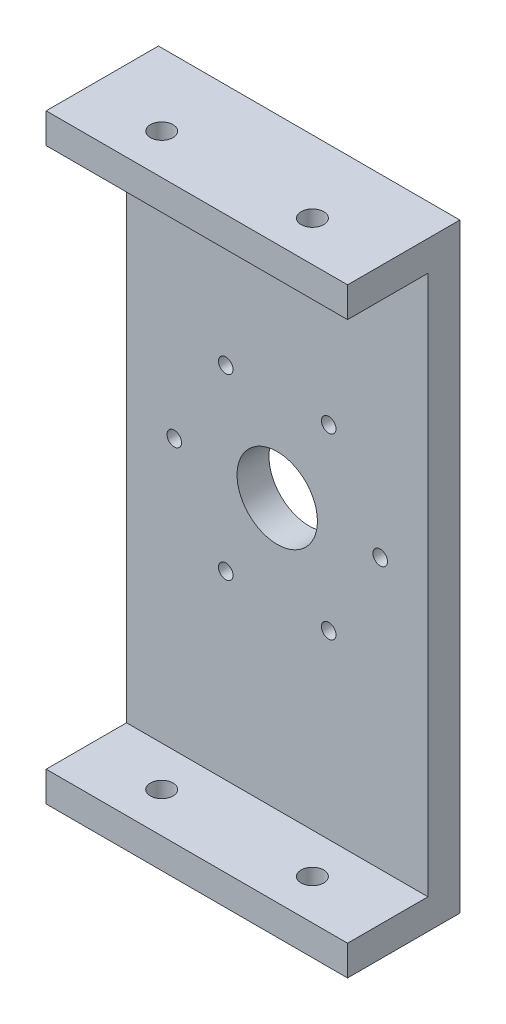
ISO-10303-21;
HEADER;
FILE_DESCRIPTION(('STEP AP214'),'2;1');
FILE_NAME('part.step','',(''),(''),'','','');
FILE_SCHEMA(('AUTOMOTIVE_DESIGN { 1 0 10303 214 1 1 1 1 }'));
ENDSEC;
DATA;
#1=APPLICATION_CONTEXT('core data for automotive mechanical design processes');
#2=APPLICATION_PROTOCOL_DEFINITION('international standard','automotive_design',2000,#1);
#3=PRODUCT_CONTEXT('',#1,'mechanical');
#4=PRODUCT('Part','Part','',(#3));
#5=PRODUCT_RELATED_PRODUCT_CATEGORY('part','',(#4));
#6=PRODUCT_DEFINITION_FORMATION('','',#4);
#7=PRODUCT_DEFINITION_CONTEXT('part definition',#1,'design');
#8=PRODUCT_DEFINITION('design','',#6,#7);
#9=PRODUCT_DEFINITION_SHAPE('','',#8);
#10=(LENGTH_UNIT() NAMED_UNIT(*) SI_UNIT(.MILLI.,.METRE.));
#11=(NAMED_UNIT(*) PLANE_ANGLE_UNIT() SI_UNIT($,.RADIAN.));
#12=(NAMED_UNIT(*) SI_UNIT($,.STERADIAN.) SOLID_ANGLE_UNIT());
#13=UNCERTAINTY_MEASURE_WITH_UNIT(LENGTH_MEASURE(1.E-05),#10,'distance_accuracy_value','');
#14=(GEOMETRIC_REPRESENTATION_CONTEXT(3) GLOBAL_UNCERTAINTY_ASSIGNED_CONTEXT((#13)) GLOBAL_UNIT_ASSIGNED_CONTEXT((#10,
#11,#12)) REPRESENTATION_CONTEXT('',''));
#15=CARTESIAN_POINT('',(0.,0.,0.));
#16=DIRECTION('',(0.,0.,1.));
#17=DIRECTION('',(1.,0.,0.));
#18=AXIS2_PLACEMENT_3D('',#15,#16,#17);
#19=CARTESIAN_POINT('',(0.,0.,379.));
#20=DIRECTION('',(0.,0.,-1.));
#21=DIRECTION('',(-1.,0.,0.));
#22=AXIS2_PLACEMENT_3D('',#19,#20,#21);
#23=PLANE('',#22);
#24=CARTESIAN_POINT('',(20.5,0.,379.));
#25=DIRECTION('',(0.,0.,1.));
#26=DIRECTION('',(1.,0.,0.));
#27=AXIS2_PLACEMENT_3D('',#24,#25,#26);
#28=CIRCLE('',#27,1.45);
#29=CARTESIAN_POINT('',(21.95,0.,379.));
#30=VERTEX_POINT('',#29);
#31=EDGE_CURVE('E159',#30,#30,#28,.T.);
#32=ORIENTED_EDGE('',*,*,#31,.F.);
#33=EDGE_LOOP('',(#32));
#34=FACE_BOUND('',#33,.T.);
#35=CARTESIAN_POINT('',(10.25,-17.753520777581,379.));
#36=DIRECTION('',(0.,0.,1.));
#37=DIRECTION('',(1.,0.,0.));
#38=AXIS2_PLACEMENT_3D('',#35,#36,#37);
#39=CIRCLE('',#38,1.45);
#40=CARTESIAN_POINT('',(11.7,-17.753520777581,379.));
#41=VERTEX_POINT('',#40);
#42=EDGE_CURVE('E137',#41,#41,#39,.T.);
#43=ORIENTED_EDGE('',*,*,#42,.F.);
#44=EDGE_LOOP('',(#43));
#45=FACE_BOUND('',#44,.T.);
#46=CARTESIAN_POINT('',(-10.25,-17.753520777581,379.));
#47=DIRECTION('',(0.,0.,1.));
#48=DIRECTION('',(1.,0.,0.));
#49=AXIS2_PLACEMENT_3D('',#46,#47,#48);
#50=CIRCLE('',#49,1.45);
#51=CARTESIAN_POINT('',(-8.80000000000001,-17.753520777581,379.));
#52=VERTEX_POINT('',#51);
#53=EDGE_CURVE('E166',#52,#52,#50,.T.);
#54=ORIENTED_EDGE('',*,*,#53,.F.);
#55=EDGE_LOOP('',(#54));
#56=FACE_BOUND('',#55,.T.);
#57=CARTESIAN_POINT('',(-20.5,0.,379.));
#58=DIRECTION('',(0.,0.,1.));
#59=DIRECTION('',(1.,0.,0.));
#60=AXIS2_PLACEMENT_3D('',#57,#58,#59);
#61=CIRCLE('',#60,1.45);
#62=CARTESIAN_POINT('',(-19.05,0.,379.));
#63=VERTEX_POINT('',#62);
#64=EDGE_CURVE('E184',#63,#63,#61,.T.);
#65=ORIENTED_EDGE('',*,*,#64,.F.);
#66=EDGE_LOOP('',(#65));
#67=FACE_BOUND('',#66,.T.);
#68=CARTESIAN_POINT('',(-10.25,17.753520777581,379.));
#69=DIRECTION('',(0.,0.,1.));
#70=DIRECTION('',(1.,0.,0.));
#71=AXIS2_PLACEMENT_3D('',#68,#69,#70);
#72=CIRCLE('',#71,1.45);
#73=CARTESIAN_POINT('',(-8.8,17.753520777581,379.));
#74=VERTEX_POINT('',#73);
#75=EDGE_CURVE('E177',#74,#74,#72,.T.);
#76=ORIENTED_EDGE('',*,*,#75,.F.);
#77=EDGE_LOOP('',(#76));
#78=FACE_BOUND('',#77,.T.);
#79=CARTESIAN_POINT('',(10.25,17.753520777581,379.));
#80=DIRECTION('',(0.,0.,1.));
#81=DIRECTION('',(1.,0.,0.));
#82=AXIS2_PLACEMENT_3D('',#79,#80,#81);
#83=CIRCLE('',#82,1.45);
#84=CARTESIAN_POINT('',(11.7,17.753520777581,379.));
#85=VERTEX_POINT('',#84);
#86=EDGE_CURVE('E173',#85,#85,#83,.T.);
#87=ORIENTED_EDGE('',*,*,#86,.F.);
#88=EDGE_LOOP('',(#87));
#89=FACE_BOUND('',#88,.T.);
#90=CARTESIAN_POINT('',(0.,0.,379.));
#91=DIRECTION('',(0.,0.,1.));
#92=DIRECTION('',(1.,0.,0.));
#93=AXIS2_PLACEMENT_3D('',#90,#91,#92);
#94=CIRCLE('',#93,8.);
#95=CARTESIAN_POINT('',(8.,0.,379.));
#96=VERTEX_POINT('',#95);
#97=EDGE_CURVE('E195',#96,#96,#94,.T.);
#98=ORIENTED_EDGE('',*,*,#97,.F.);
#99=EDGE_LOOP('',(#98));
#100=FACE_BOUND('',#99,.T.);
#101=DIRECTION('',(1.,0.,0.));
#102=VECTOR('',#101,1.);
#103=CARTESIAN_POINT('',(-30.,53.75,379.));
#104=LINE('',#103,#102);
#105=CARTESIAN_POINT('',(-30.,53.75,379.));
#106=VERTEX_POINT('',#105);
#107=CARTESIAN_POINT('',(30.,53.75,379.));
#108=VERTEX_POINT('',#107);
#109=EDGE_CURVE('E57',#106,#108,#104,.T.);
#110=ORIENTED_EDGE('',*,*,#109,.F.);
#111=DIRECTION('',(0.,-1.,0.));
#112=VECTOR('',#111,1.);
#113=CARTESIAN_POINT('',(-30.,-59.75,379.));
#114=LINE('',#113,#112);
#115=CARTESIAN_POINT('',(-30.,-53.75,379.));
#116=VERTEX_POINT('',#115);
#117=EDGE_CURVE('E199',#106,#116,#114,.T.);
#118=ORIENTED_EDGE('',*,*,#117,.T.);
#119=DIRECTION('',(-1.,0.,0.));
#120=VECTOR('',#119,1.);
#121=CARTESIAN_POINT('',(-30.,-53.75,379.));
#122=LINE('',#121,#120);
#123=CARTESIAN_POINT('',(30.,-53.75,379.));
#124=VERTEX_POINT('',#123);
#125=EDGE_CURVE('E64',#124,#116,#122,.T.);
#126=ORIENTED_EDGE('',*,*,#125,.F.);
#127=DIRECTION('',(0.,1.,0.));
#128=VECTOR('',#127,1.);
#129=CARTESIAN_POINT('',(30.,-59.75,379.));
#130=LINE('',#129,#128);
#131=EDGE_CURVE('E197',#124,#108,#130,.T.);
#132=ORIENTED_EDGE('',*,*,#131,.T.);
#133=EDGE_LOOP('',(#110,#118,#126,#132));
#134=FACE_BOUND('',#133,.T.);
#135=ADVANCED_FACE('F39',(#34,#45,#56,#67,#78,#89,#100,#134),#23,.F.);
#136=CARTESIAN_POINT('',(30.,-59.75,379.));
#137=DIRECTION('',(-1.,0.,0.));
#138=DIRECTION('',(0.,0.,1.));
#139=AXIS2_PLACEMENT_3D('',#136,#137,#138);
#140=PLANE('',#139);
#141=DIRECTION('',(0.,1.,0.));
#142=VECTOR('',#141,1.);
#143=CARTESIAN_POINT('',(30.,-59.75,372.65));
#144=LINE('',#143,#142);
#145=CARTESIAN_POINT('',(30.,-59.75,372.65));
#146=VERTEX_POINT('',#145);
#147=CARTESIAN_POINT('',(30.,59.75,372.65));
#148=VERTEX_POINT('',#147);
#149=EDGE_CURVE('E111',#146,#148,#144,.T.);
#150=ORIENTED_EDGE('',*,*,#149,.T.);
#151=DIRECTION('',(0.,0.,-1.));
#152=VECTOR('',#151,1.);
#153=CARTESIAN_POINT('',(30.,59.75,379.));
#154=LINE('',#153,#152);
#155=CARTESIAN_POINT('',(30.,59.75,395.));
#156=VERTEX_POINT('',#155);
#157=EDGE_CURVE('E11',#156,#148,#154,.T.);
#158=ORIENTED_EDGE('',*,*,#157,.F.);
#159=DIRECTION('',(0.,1.,0.));
#160=VECTOR('',#159,1.);
#161=CARTESIAN_POINT('',(30.,53.75,395.));
#162=LINE('',#161,#160);
#163=CARTESIAN_POINT('',(30.,53.75,395.));
#164=VERTEX_POINT('',#163);
#165=EDGE_CURVE('E108',#164,#156,#162,.T.);
#166=ORIENTED_EDGE('',*,*,#165,.F.);
#167=DIRECTION('',(0.,0.,-1.));
#168=VECTOR('',#167,1.);
#169=CARTESIAN_POINT('',(30.,53.75,395.));
#170=LINE('',#169,#168);
#171=EDGE_CURVE('E135',#164,#108,#170,.T.);
#172=ORIENTED_EDGE('',*,*,#171,.T.);
#173=ORIENTED_EDGE('',*,*,#131,.F.);
#174=DIRECTION('',(0.,0.,-1.));
#175=VECTOR('',#174,1.);
#176=CARTESIAN_POINT('',(30.,-53.75,395.));
#177=LINE('',#176,#175);
#178=CARTESIAN_POINT('',(30.,-53.75,395.));
#179=VERTEX_POINT('',#178);
#180=EDGE_CURVE('E140',#179,#124,#177,.T.);
#181=ORIENTED_EDGE('',*,*,#180,.F.);
#182=DIRECTION('',(0.,1.,0.));
#183=VECTOR('',#182,1.);
#184=CARTESIAN_POINT('',(30.,-59.75,395.));
#185=LINE('',#184,#183);
#186=CARTESIAN_POINT('',(30.,-59.75,395.));
#187=VERTEX_POINT('',#186);
#188=EDGE_CURVE('E146',#187,#179,#185,.T.);
#189=ORIENTED_EDGE('',*,*,#188,.F.);
#190=DIRECTION('',(0.,0.,-1.));
#191=VECTOR('',#190,1.);
#192=CARTESIAN_POINT('',(30.,-59.75,379.));
#193=LINE('',#192,#191);
#194=EDGE_CURVE('E202',#187,#146,#193,.T.);
#195=ORIENTED_EDGE('',*,*,#194,.T.);
#196=EDGE_LOOP('',(#150,#158,#166,#172,#173,#181,#189,#195));
#197=FACE_BOUND('',#196,.T.);
#198=ADVANCED_FACE('F41',(#197),#140,.F.);
#199=CARTESIAN_POINT('',(-30.,59.75,379.));
#200=DIRECTION('',(0.,-1.,0.));
#201=DIRECTION('',(0.,0.,-1.));
#202=AXIS2_PLACEMENT_3D('',#199,#200,#201);
#203=PLANE('',#202);
#204=CARTESIAN_POINT('',(-15.,59.75,387.));
#205=DIRECTION('',(0.,1.,0.));
#206=DIRECTION('',(0.,0.,1.));
#207=AXIS2_PLACEMENT_3D('',#204,#205,#206);
#208=CIRCLE('',#207,2.25);
#209=CARTESIAN_POINT('',(-15.,59.75,389.25));
#210=VERTEX_POINT('',#209);
#211=EDGE_CURVE('E220',#210,#210,#208,.T.);
#212=ORIENTED_EDGE('',*,*,#211,.F.);
#213=EDGE_LOOP('',(#212));
#214=FACE_BOUND('',#213,.T.);
#215=CARTESIAN_POINT('',(15.,59.75,387.));
#216=DIRECTION('',(0.,1.,0.));
#217=DIRECTION('',(0.,0.,1.));
#218=AXIS2_PLACEMENT_3D('',#215,#216,#217);
#219=CIRCLE('',#218,2.25);
#220=CARTESIAN_POINT('',(15.,59.75,389.25));
#221=VERTEX_POINT('',#220);
#222=EDGE_CURVE('E235',#221,#221,#219,.T.);
#223=ORIENTED_EDGE('',*,*,#222,.F.);
#224=EDGE_LOOP('',(#223));
#225=FACE_BOUND('',#224,.T.);
#226=DIRECTION('',(-1.,0.,0.));
#227=VECTOR('',#226,1.);
#228=CARTESIAN_POINT('',(-30.,59.75,372.65));
#229=LINE('',#228,#227);
#230=CARTESIAN_POINT('',(-30.,59.75,372.65));
#231=VERTEX_POINT('',#230);
#232=EDGE_CURVE('E201',#148,#231,#229,.T.);
#233=ORIENTED_EDGE('',*,*,#232,.T.);
#234=DIRECTION('',(0.,0.,-1.));
#235=VECTOR('',#234,1.);
#236=CARTESIAN_POINT('',(-30.,59.75,379.));
#237=LINE('',#236,#235);
#238=CARTESIAN_POINT('',(-30.,59.75,395.));
#239=VERTEX_POINT('',#238);
#240=EDGE_CURVE('E48',#239,#231,#237,.T.);
#241=ORIENTED_EDGE('',*,*,#240,.F.);
#242=DIRECTION('',(-1.,0.,0.));
#243=VECTOR('',#242,1.);
#244=CARTESIAN_POINT('',(-30.,59.75,395.));
#245=LINE('',#244,#243);
#246=EDGE_CURVE('E112',#156,#239,#245,.T.);
#247=ORIENTED_EDGE('',*,*,#246,.F.);
#248=ORIENTED_EDGE('',*,*,#157,.T.);
#249=EDGE_LOOP('',(#233,#241,#247,#248));
#250=FACE_BOUND('',#249,.T.);
#251=ADVANCED_FACE('F114',(#214,#225,#250),#203,.F.);
#252=CARTESIAN_POINT('',(-30.,-59.75,379.));
#253=DIRECTION('',(1.,0.,0.));
#254=DIRECTION('',(0.,0.,-1.));
#255=AXIS2_PLACEMENT_3D('',#252,#253,#254);
#256=PLANE('',#255);
#257=DIRECTION('',(0.,-1.,0.));
#258=VECTOR('',#257,1.);
#259=CARTESIAN_POINT('',(-30.,-59.75,372.65));
#260=LINE('',#259,#258);
#261=CARTESIAN_POINT('',(-30.,-59.75,372.65));
#262=VERTEX_POINT('',#261);
#263=EDGE_CURVE('E210',#231,#262,#260,.T.);
#264=ORIENTED_EDGE('',*,*,#263,.T.);
#265=DIRECTION('',(0.,0.,-1.));
#266=VECTOR('',#265,1.);
#267=CARTESIAN_POINT('',(-30.,-59.75,379.));
#268=LINE('',#267,#266);
#269=CARTESIAN_POINT('',(-30.,-59.75,395.));
#270=VERTEX_POINT('',#269);
#271=EDGE_CURVE('E214',#270,#262,#268,.T.);
#272=ORIENTED_EDGE('',*,*,#271,.F.);
#273=DIRECTION('',(0.,-1.,0.));
#274=VECTOR('',#273,1.);
#275=CARTESIAN_POINT('',(-30.,-59.75,395.));
#276=LINE('',#275,#274);
#277=CARTESIAN_POINT('',(-30.,-53.75,395.));
#278=VERTEX_POINT('',#277);
#279=EDGE_CURVE('E147',#278,#270,#276,.T.);
#280=ORIENTED_EDGE('',*,*,#279,.F.);
#281=DIRECTION('',(0.,0.,-1.));
#282=VECTOR('',#281,1.);
#283=CARTESIAN_POINT('',(-30.,-53.75,395.));
#284=LINE('',#283,#282);
#285=EDGE_CURVE('E145',#278,#116,#284,.T.);
#286=ORIENTED_EDGE('',*,*,#285,.T.);
#287=ORIENTED_EDGE('',*,*,#117,.F.);
#288=DIRECTION('',(0.,0.,-1.));
#289=VECTOR('',#288,1.);
#290=CARTESIAN_POINT('',(-30.,53.75,395.));
#291=LINE('',#290,#289);
#292=CARTESIAN_POINT('',(-30.,53.75,395.));
#293=VERTEX_POINT('',#292);
#294=EDGE_CURVE('E134',#293,#106,#291,.T.);
#295=ORIENTED_EDGE('',*,*,#294,.F.);
#296=DIRECTION('',(0.,-1.,0.));
#297=VECTOR('',#296,1.);
#298=CARTESIAN_POINT('',(-30.,53.75,395.));
#299=LINE('',#298,#297);
#300=EDGE_CURVE('E118',#239,#293,#299,.T.);
#301=ORIENTED_EDGE('',*,*,#300,.F.);
#302=ORIENTED_EDGE('',*,*,#240,.T.);
#303=EDGE_LOOP('',(#264,#272,#280,#286,#287,#295,#301,#302));
#304=FACE_BOUND('',#303,.T.);
#305=ADVANCED_FACE('F237',(#304),#256,.F.);
#306=CARTESIAN_POINT('',(-30.,-59.75,379.));
#307=DIRECTION('',(0.,1.,0.));
#308=DIRECTION('',(0.,0.,1.));
#309=AXIS2_PLACEMENT_3D('',#306,#307,#308);
#310=PLANE('',#309);
#311=CARTESIAN_POINT('',(-15.,-59.75,387.));
#312=DIRECTION('',(0.,1.,0.));
#313=DIRECTION('',(0.,0.,1.));
#314=AXIS2_PLACEMENT_3D('',#311,#312,#313);
#315=CIRCLE('',#314,2.25);
#316=CARTESIAN_POINT('',(-15.,-59.75,389.25));
#317=VERTEX_POINT('',#316);
#318=EDGE_CURVE('E224',#317,#317,#315,.T.);
#319=ORIENTED_EDGE('',*,*,#318,.T.);
#320=EDGE_LOOP('',(#319));
#321=FACE_BOUND('',#320,.T.);
#322=CARTESIAN_POINT('',(15.,-59.75,387.));
#323=DIRECTION('',(0.,1.,0.));
#324=DIRECTION('',(0.,0.,1.));
#325=AXIS2_PLACEMENT_3D('',#322,#323,#324);
#326=CIRCLE('',#325,2.25);
#327=CARTESIAN_POINT('',(15.,-59.75,389.25));
#328=VERTEX_POINT('',#327);
#329=EDGE_CURVE('E227',#328,#328,#326,.T.);
#330=ORIENTED_EDGE('',*,*,#329,.T.);
#331=EDGE_LOOP('',(#330));
#332=FACE_BOUND('',#331,.T.);
#333=DIRECTION('',(1.,0.,0.));
#334=VECTOR('',#333,1.);
#335=CARTESIAN_POINT('',(-30.,-59.75,372.65));
#336=LINE('',#335,#334);
#337=EDGE_CURVE('E203',#262,#146,#336,.T.);
#338=ORIENTED_EDGE('',*,*,#337,.T.);
#339=ORIENTED_EDGE('',*,*,#194,.F.);
#340=DIRECTION('',(1.,0.,0.));
#341=VECTOR('',#340,1.);
#342=CARTESIAN_POINT('',(-30.,-59.75,395.));
#343=LINE('',#342,#341);
#344=EDGE_CURVE('E143',#270,#187,#343,.T.);
#345=ORIENTED_EDGE('',*,*,#344,.F.);
#346=ORIENTED_EDGE('',*,*,#271,.T.);
#347=EDGE_LOOP('',(#338,#339,#345,#346));
#348=FACE_BOUND('',#347,.T.);
#349=ADVANCED_FACE('F250',(#321,#332,#348),#310,.F.);
#350=CARTESIAN_POINT('',(0.,0.,372.65));
#351=DIRECTION('',(0.,0.,-1.));
#352=DIRECTION('',(-1.,0.,0.));
#353=AXIS2_PLACEMENT_3D('',#350,#351,#352);
#354=PLANE('',#353);
#355=CARTESIAN_POINT('',(20.5,0.,372.65));
#356=DIRECTION('',(0.,0.,1.));
#357=DIRECTION('',(1.,0.,0.));
#358=AXIS2_PLACEMENT_3D('',#355,#356,#357);
#359=CIRCLE('',#358,1.45);
#360=CARTESIAN_POINT('',(21.95,0.,372.65));
#361=VERTEX_POINT('',#360);
#362=EDGE_CURVE('E163',#361,#361,#359,.T.);
#363=ORIENTED_EDGE('',*,*,#362,.T.);
#364=EDGE_LOOP('',(#363));
#365=FACE_BOUND('',#364,.T.);
#366=CARTESIAN_POINT('',(10.25,-17.753520777581,372.65));
#367=DIRECTION('',(0.,0.,1.));
#368=DIRECTION('',(1.,0.,0.));
#369=AXIS2_PLACEMENT_3D('',#366,#367,#368);
#370=CIRCLE('',#369,1.45);
#371=CARTESIAN_POINT('',(11.7,-17.753520777581,372.65));
#372=VERTEX_POINT('',#371);
#373=EDGE_CURVE('E164',#372,#372,#370,.T.);
#374=ORIENTED_EDGE('',*,*,#373,.T.);
#375=EDGE_LOOP('',(#374));
#376=FACE_BOUND('',#375,.T.);
#377=CARTESIAN_POINT('',(-10.25,-17.753520777581,372.65));
#378=DIRECTION('',(0.,0.,1.));
#379=DIRECTION('',(1.,0.,0.));
#380=AXIS2_PLACEMENT_3D('',#377,#378,#379);
#381=CIRCLE('',#380,1.45);
#382=CARTESIAN_POINT('',(-8.80000000000001,-17.753520777581,372.65));
#383=VERTEX_POINT('',#382);
#384=EDGE_CURVE('E189',#383,#383,#381,.T.);
#385=ORIENTED_EDGE('',*,*,#384,.T.);
#386=EDGE_LOOP('',(#385));
#387=FACE_BOUND('',#386,.T.);
#388=CARTESIAN_POINT('',(-20.5,0.,372.65));
#389=DIRECTION('',(0.,0.,1.));
#390=DIRECTION('',(1.,0.,0.));
#391=AXIS2_PLACEMENT_3D('',#388,#389,#390);
#392=CIRCLE('',#391,1.45);
#393=CARTESIAN_POINT('',(-19.05,0.,372.65));
#394=VERTEX_POINT('',#393);
#395=EDGE_CURVE('E185',#394,#394,#392,.T.);
#396=ORIENTED_EDGE('',*,*,#395,.T.);
#397=EDGE_LOOP('',(#396));
#398=FACE_BOUND('',#397,.T.);
#399=CARTESIAN_POINT('',(-10.25,17.753520777581,372.65));
#400=DIRECTION('',(0.,0.,1.));
#401=DIRECTION('',(1.,0.,0.));
#402=AXIS2_PLACEMENT_3D('',#399,#400,#401);
#403=CIRCLE('',#402,1.45);
#404=CARTESIAN_POINT('',(-8.8,17.753520777581,372.65));
#405=VERTEX_POINT('',#404);
#406=EDGE_CURVE('E176',#405,#405,#403,.T.);
#407=ORIENTED_EDGE('',*,*,#406,.T.);
#408=EDGE_LOOP('',(#407));
#409=FACE_BOUND('',#408,.T.);
#410=CARTESIAN_POINT('',(10.25,17.753520777581,372.65));
#411=DIRECTION('',(0.,0.,1.));
#412=DIRECTION('',(1.,0.,0.));
#413=AXIS2_PLACEMENT_3D('',#410,#411,#412);
#414=CIRCLE('',#413,1.45);
#415=CARTESIAN_POINT('',(11.7,17.753520777581,372.65));
#416=VERTEX_POINT('',#415);
#417=EDGE_CURVE('E165',#416,#416,#414,.T.);
#418=ORIENTED_EDGE('',*,*,#417,.T.);
#419=EDGE_LOOP('',(#418));
#420=FACE_BOUND('',#419,.T.);
#421=CARTESIAN_POINT('',(0.,0.,372.65));
#422=DIRECTION('',(0.,0.,1.));
#423=DIRECTION('',(1.,0.,0.));
#424=AXIS2_PLACEMENT_3D('',#421,#422,#423);
#425=CIRCLE('',#424,8.);
#426=CARTESIAN_POINT('',(8.,0.,372.65));
#427=VERTEX_POINT('',#426);
#428=EDGE_CURVE('E156',#427,#427,#425,.T.);
#429=ORIENTED_EDGE('',*,*,#428,.T.);
#430=EDGE_LOOP('',(#429));
#431=FACE_BOUND('',#430,.T.);
#432=ORIENTED_EDGE('',*,*,#149,.F.);
#433=ORIENTED_EDGE('',*,*,#337,.F.);
#434=ORIENTED_EDGE('',*,*,#263,.F.);
#435=ORIENTED_EDGE('',*,*,#232,.F.);
#436=EDGE_LOOP('',(#432,#433,#434,#435));
#437=FACE_BOUND('',#436,.T.);
#438=ADVANCED_FACE('F263',(#365,#376,#387,#398,#409,#420,#431,#437),#354,.T.);
#439=CARTESIAN_POINT('',(0.,0.,379.));
#440=DIRECTION('',(0.,0.,-1.));
#441=DIRECTION('',(-1.,0.,0.));
#442=AXIS2_PLACEMENT_3D('',#439,#440,#441);
#443=CYLINDRICAL_SURFACE('',#442,8.);
#444=ORIENTED_EDGE('',*,*,#97,.T.);
#445=EDGE_LOOP('',(#444));
#446=FACE_BOUND('',#445,.T.);
#447=ORIENTED_EDGE('',*,*,#428,.F.);
#448=EDGE_LOOP('',(#447));
#449=FACE_BOUND('',#448,.T.);
#450=ADVANCED_FACE('F265',(#446,#449),#443,.F.);
#451=CARTESIAN_POINT('',(10.25,17.753520777581,379.));
#452=DIRECTION('',(0.,0.,-1.));
#453=DIRECTION('',(-1.,0.,0.));
#454=AXIS2_PLACEMENT_3D('',#451,#452,#453);
#455=CYLINDRICAL_SURFACE('',#454,1.45);
#456=ORIENTED_EDGE('',*,*,#86,.T.);
#457=EDGE_LOOP('',(#456));
#458=FACE_BOUND('',#457,.T.);
#459=ORIENTED_EDGE('',*,*,#417,.F.);
#460=EDGE_LOOP('',(#459));
#461=FACE_BOUND('',#460,.T.);
#462=ADVANCED_FACE('F315',(#458,#461),#455,.F.);
#463=CARTESIAN_POINT('',(-10.25,17.753520777581,379.));
#464=DIRECTION('',(0.,0.,-1.));
#465=DIRECTION('',(-1.,0.,0.));
#466=AXIS2_PLACEMENT_3D('',#463,#464,#465);
#467=CYLINDRICAL_SURFACE('',#466,1.45);
#468=ORIENTED_EDGE('',*,*,#75,.T.);
#469=EDGE_LOOP('',(#468));
#470=FACE_BOUND('',#469,.T.);
#471=ORIENTED_EDGE('',*,*,#406,.F.);
#472=EDGE_LOOP('',(#471));
#473=FACE_BOUND('',#472,.T.);
#474=ADVANCED_FACE('F314',(#470,#473),#467,.F.);
#475=CARTESIAN_POINT('',(-20.5,0.,379.));
#476=DIRECTION('',(0.,0.,-1.));
#477=DIRECTION('',(-1.,0.,0.));
#478=AXIS2_PLACEMENT_3D('',#475,#476,#477);
#479=CYLINDRICAL_SURFACE('',#478,1.45);
#480=ORIENTED_EDGE('',*,*,#64,.T.);
#481=EDGE_LOOP('',(#480));
#482=FACE_BOUND('',#481,.T.);
#483=ORIENTED_EDGE('',*,*,#395,.F.);
#484=EDGE_LOOP('',(#483));
#485=FACE_BOUND('',#484,.T.);
#486=ADVANCED_FACE('F316',(#482,#485),#479,.F.);
#487=CARTESIAN_POINT('',(-10.25,-17.753520777581,379.));
#488=DIRECTION('',(0.,0.,-1.));
#489=DIRECTION('',(-1.,0.,0.));
#490=AXIS2_PLACEMENT_3D('',#487,#488,#489);
#491=CYLINDRICAL_SURFACE('',#490,1.45);
#492=ORIENTED_EDGE('',*,*,#53,.T.);
#493=EDGE_LOOP('',(#492));
#494=FACE_BOUND('',#493,.T.);
#495=ORIENTED_EDGE('',*,*,#384,.F.);
#496=EDGE_LOOP('',(#495));
#497=FACE_BOUND('',#496,.T.);
#498=ADVANCED_FACE('F309',(#494,#497),#491,.F.);
#499=CARTESIAN_POINT('',(10.25,-17.753520777581,379.));
#500=DIRECTION('',(0.,0.,-1.));
#501=DIRECTION('',(-1.,0.,0.));
#502=AXIS2_PLACEMENT_3D('',#499,#500,#501);
#503=CYLINDRICAL_SURFACE('',#502,1.45);
#504=ORIENTED_EDGE('',*,*,#42,.T.);
#505=EDGE_LOOP('',(#504));
#506=FACE_BOUND('',#505,.T.);
#507=ORIENTED_EDGE('',*,*,#373,.F.);
#508=EDGE_LOOP('',(#507));
#509=FACE_BOUND('',#508,.T.);
#510=ADVANCED_FACE('F306',(#506,#509),#503,.F.);
#511=CARTESIAN_POINT('',(20.5,0.,379.));
#512=DIRECTION('',(0.,0.,-1.));
#513=DIRECTION('',(-1.,0.,0.));
#514=AXIS2_PLACEMENT_3D('',#511,#512,#513);
#515=CYLINDRICAL_SURFACE('',#514,1.45);
#516=ORIENTED_EDGE('',*,*,#31,.T.);
#517=EDGE_LOOP('',(#516));
#518=FACE_BOUND('',#517,.T.);
#519=ORIENTED_EDGE('',*,*,#362,.F.);
#520=EDGE_LOOP('',(#519));
#521=FACE_BOUND('',#520,.T.);
#522=ADVANCED_FACE('F301',(#518,#521),#515,.F.);
#523=CARTESIAN_POINT('',(-30.,-53.75,395.));
#524=DIRECTION('',(0.,-1.,0.));
#525=DIRECTION('',(0.,0.,-1.));
#526=AXIS2_PLACEMENT_3D('',#523,#524,#525);
#527=PLANE('',#526);
#528=CARTESIAN_POINT('',(-15.,-53.75,387.));
#529=DIRECTION('',(0.,-1.,0.));
#530=DIRECTION('',(0.,0.,-1.));
#531=AXIS2_PLACEMENT_3D('',#528,#529,#530);
#532=CIRCLE('',#531,2.25);
#533=CARTESIAN_POINT('',(-15.,-53.75,384.75));
#534=VERTEX_POINT('',#533);
#535=EDGE_CURVE('E130',#534,#534,#532,.F.);
#536=ORIENTED_EDGE('',*,*,#535,.F.);
#537=EDGE_LOOP('',(#536));
#538=FACE_BOUND('',#537,.T.);
#539=CARTESIAN_POINT('',(15.,-53.75,387.));
#540=DIRECTION('',(0.,-1.,0.));
#541=DIRECTION('',(0.,0.,-1.));
#542=AXIS2_PLACEMENT_3D('',#539,#540,#541);
#543=CIRCLE('',#542,2.25);
#544=CARTESIAN_POINT('',(15.,-53.75,384.75));
#545=VERTEX_POINT('',#544);
#546=EDGE_CURVE('E216',#545,#545,#543,.F.);
#547=ORIENTED_EDGE('',*,*,#546,.F.);
#548=EDGE_LOOP('',(#547));
#549=FACE_BOUND('',#548,.T.);
#550=ORIENTED_EDGE('',*,*,#125,.T.);
#551=ORIENTED_EDGE('',*,*,#285,.F.);
#552=DIRECTION('',(-1.,0.,0.));
#553=VECTOR('',#552,1.);
#554=CARTESIAN_POINT('',(-30.,-53.75,395.));
#555=LINE('',#554,#553);
#556=EDGE_CURVE('E152',#179,#278,#555,.T.);
#557=ORIENTED_EDGE('',*,*,#556,.F.);
#558=ORIENTED_EDGE('',*,*,#180,.T.);
#559=EDGE_LOOP('',(#550,#551,#557,#558));
#560=FACE_BOUND('',#559,.T.);
#561=ADVANCED_FACE('F287',(#538,#549,#560),#527,.F.);
#562=CARTESIAN_POINT('',(0.,0.,395.));
#563=DIRECTION('',(0.,0.,-1.));
#564=DIRECTION('',(-1.,0.,0.));
#565=AXIS2_PLACEMENT_3D('',#562,#563,#564);
#566=PLANE('',#565);
#567=ORIENTED_EDGE('',*,*,#188,.T.);
#568=ORIENTED_EDGE('',*,*,#556,.T.);
#569=ORIENTED_EDGE('',*,*,#279,.T.);
#570=ORIENTED_EDGE('',*,*,#344,.T.);
#571=EDGE_LOOP('',(#567,#568,#569,#570));
#572=FACE_BOUND('',#571,.T.);
#573=ADVANCED_FACE('F292',(#572),#566,.F.);
#574=CARTESIAN_POINT('',(-30.,53.75,395.));
#575=DIRECTION('',(0.,1.,0.));
#576=DIRECTION('',(0.,0.,1.));
#577=AXIS2_PLACEMENT_3D('',#574,#575,#576);
#578=PLANE('',#577);
#579=CARTESIAN_POINT('',(-15.,53.75,387.));
#580=DIRECTION('',(0.,1.,0.));
#581=DIRECTION('',(0.,0.,1.));
#582=AXIS2_PLACEMENT_3D('',#579,#580,#581);
#583=CIRCLE('',#582,2.25);
#584=CARTESIAN_POINT('',(-15.,53.75,389.25));
#585=VERTEX_POINT('',#584);
#586=EDGE_CURVE('E43',#585,#585,#583,.F.);
#587=ORIENTED_EDGE('',*,*,#586,.F.);
#588=EDGE_LOOP('',(#587));
#589=FACE_BOUND('',#588,.T.);
#590=CARTESIAN_POINT('',(15.,53.75,387.));
#591=DIRECTION('',(0.,1.,0.));
#592=DIRECTION('',(0.,0.,1.));
#593=AXIS2_PLACEMENT_3D('',#590,#591,#592);
#594=CIRCLE('',#593,2.25);
#595=CARTESIAN_POINT('',(15.,53.75,389.25));
#596=VERTEX_POINT('',#595);
#597=EDGE_CURVE('E213',#596,#596,#594,.F.);
#598=ORIENTED_EDGE('',*,*,#597,.F.);
#599=EDGE_LOOP('',(#598));
#600=FACE_BOUND('',#599,.T.);
#601=ORIENTED_EDGE('',*,*,#109,.T.);
#602=ORIENTED_EDGE('',*,*,#171,.F.);
#603=DIRECTION('',(1.,0.,0.));
#604=VECTOR('',#603,1.);
#605=CARTESIAN_POINT('',(-30.,53.75,395.));
#606=LINE('',#605,#604);
#607=EDGE_CURVE('E124',#293,#164,#606,.T.);
#608=ORIENTED_EDGE('',*,*,#607,.F.);
#609=ORIENTED_EDGE('',*,*,#294,.T.);
#610=EDGE_LOOP('',(#601,#602,#608,#609));
#611=FACE_BOUND('',#610,.T.);
#612=ADVANCED_FACE('F288',(#589,#600,#611),#578,.F.);
#613=CARTESIAN_POINT('',(0.,0.,395.));
#614=DIRECTION('',(0.,0.,-1.));
#615=DIRECTION('',(-1.,0.,0.));
#616=AXIS2_PLACEMENT_3D('',#613,#614,#615);
#617=PLANE('',#616);
#618=ORIENTED_EDGE('',*,*,#165,.T.);
#619=ORIENTED_EDGE('',*,*,#246,.T.);
#620=ORIENTED_EDGE('',*,*,#300,.T.);
#621=ORIENTED_EDGE('',*,*,#607,.T.);
#622=EDGE_LOOP('',(#618,#619,#620,#621));
#623=FACE_BOUND('',#622,.T.);
#624=ADVANCED_FACE('F122',(#623),#617,.F.);
#625=CARTESIAN_POINT('',(15.,59.75,387.));
#626=DIRECTION('',(0.,-1.,0.));
#627=DIRECTION('',(0.,0.,-1.));
#628=AXIS2_PLACEMENT_3D('',#625,#626,#627);
#629=CYLINDRICAL_SURFACE('',#628,2.25);
#630=ORIENTED_EDGE('',*,*,#222,.T.);
#631=EDGE_LOOP('',(#630));
#632=FACE_BOUND('',#631,.T.);
#633=ORIENTED_EDGE('',*,*,#597,.T.);
#634=EDGE_LOOP('',(#633));
#635=FACE_BOUND('',#634,.T.);
#636=ADVANCED_FACE('F236',(#632,#635),#629,.F.);
#637=CARTESIAN_POINT('',(-15.,59.75,387.));
#638=DIRECTION('',(0.,-1.,0.));
#639=DIRECTION('',(0.,0.,-1.));
#640=AXIS2_PLACEMENT_3D('',#637,#638,#639);
#641=CYLINDRICAL_SURFACE('',#640,2.25);
#642=ORIENTED_EDGE('',*,*,#211,.T.);
#643=EDGE_LOOP('',(#642));
#644=FACE_BOUND('',#643,.T.);
#645=ORIENTED_EDGE('',*,*,#586,.T.);
#646=EDGE_LOOP('',(#645));
#647=FACE_BOUND('',#646,.T.);
#648=ADVANCED_FACE('F392',(#644,#647),#641,.F.);
#649=ORIENTED_EDGE('',*,*,#329,.F.);
#650=EDGE_LOOP('',(#649));
#651=FACE_BOUND('',#650,.T.);
#652=ORIENTED_EDGE('',*,*,#546,.T.);
#653=EDGE_LOOP('',(#652));
#654=FACE_BOUND('',#653,.T.);
#655=ADVANCED_FACE('F394',(#651,#654),#629,.F.);
#656=ORIENTED_EDGE('',*,*,#318,.F.);
#657=EDGE_LOOP('',(#656));
#658=FACE_BOUND('',#657,.T.);
#659=ORIENTED_EDGE('',*,*,#535,.T.);
#660=EDGE_LOOP('',(#659));
#661=FACE_BOUND('',#660,.T.);
#662=ADVANCED_FACE('F405',(#658,#661),#641,.F.);
#663=CLOSED_SHELL('',(#135,#198,#251,#305,#349,#438,#450,#462,#474,#486,#498,#510,#522,#561,
#573,#612,#624,#636,#648,#655,#662));
#664=MANIFOLD_SOLID_BREP('B2',#663);
#665=ADVANCED_BREP_SHAPE_REPRESENTATION('',(#18,#664),#14);
#666=SHAPE_DEFINITION_REPRESENTATION(#9,#665);
ENDSEC;
END-ISO-10303-21;
